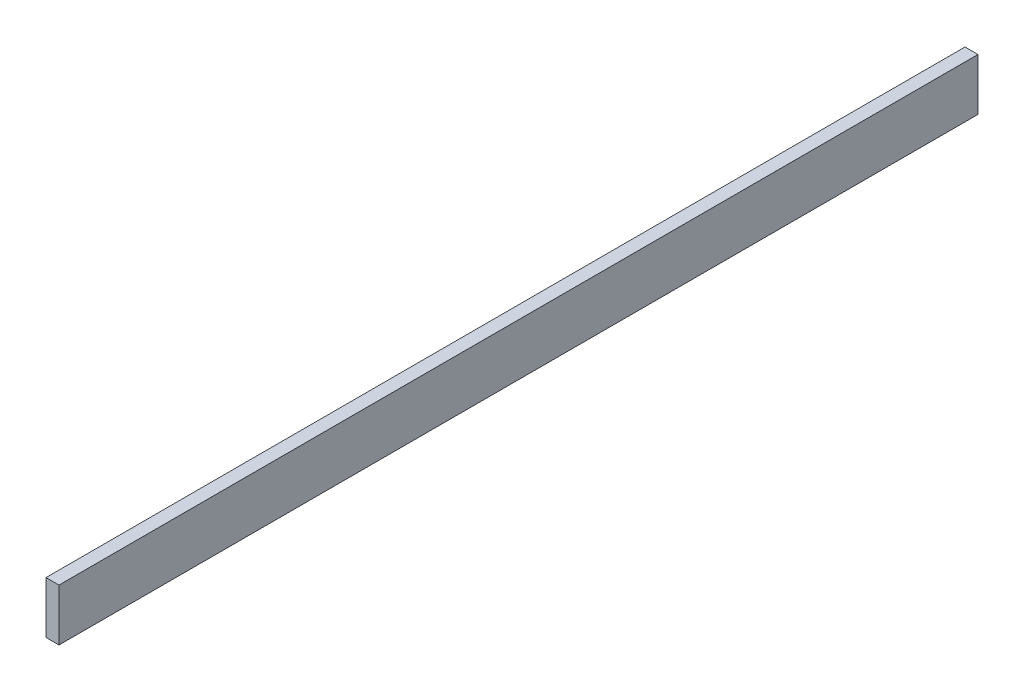
ISO-10303-21;
HEADER;
FILE_DESCRIPTION(('STEP AP214'),'2;1');
FILE_NAME('part.step','',(''),(''),'','','');
FILE_SCHEMA(('AUTOMOTIVE_DESIGN { 1 0 10303 214 1 1 1 1 }'));
ENDSEC;
DATA;
#1=APPLICATION_CONTEXT('core data for automotive mechanical design processes');
#2=APPLICATION_PROTOCOL_DEFINITION('international standard','automotive_design',2000,#1);
#3=PRODUCT_CONTEXT('',#1,'mechanical');
#4=PRODUCT('Part','Part','',(#3));
#5=PRODUCT_RELATED_PRODUCT_CATEGORY('part','',(#4));
#6=PRODUCT_DEFINITION_FORMATION('','',#4);
#7=PRODUCT_DEFINITION_CONTEXT('part definition',#1,'design');
#8=PRODUCT_DEFINITION('design','',#6,#7);
#9=PRODUCT_DEFINITION_SHAPE('','',#8);
#10=(LENGTH_UNIT() NAMED_UNIT(*) SI_UNIT(.MILLI.,.METRE.));
#11=(NAMED_UNIT(*) PLANE_ANGLE_UNIT() SI_UNIT($,.RADIAN.));
#12=(NAMED_UNIT(*) SI_UNIT($,.STERADIAN.) SOLID_ANGLE_UNIT());
#13=UNCERTAINTY_MEASURE_WITH_UNIT(LENGTH_MEASURE(1.E-05),#10,'distance_accuracy_value','');
#14=(GEOMETRIC_REPRESENTATION_CONTEXT(3) GLOBAL_UNCERTAINTY_ASSIGNED_CONTEXT((#13)) GLOBAL_UNIT_ASSIGNED_CONTEXT((#10,
#11,#12)) REPRESENTATION_CONTEXT('',''));
#15=CARTESIAN_POINT('',(0.,0.,0.));
#16=DIRECTION('',(0.,0.,1.));
#17=DIRECTION('',(1.,0.,0.));
#18=AXIS2_PLACEMENT_3D('',#15,#16,#17);
#19=CARTESIAN_POINT('',(0.,0.,224.79));
#20=DIRECTION('',(1.,0.,0.));
#21=DIRECTION('',(0.,0.,-1.));
#22=AXIS2_PLACEMENT_3D('',#19,#20,#21);
#23=PLANE('',#22);
#24=DIRECTION('',(0.,-1.,0.));
#25=VECTOR('',#24,1.);
#26=CARTESIAN_POINT('',(0.,0.,0.));
#27=LINE('',#26,#25);
#28=CARTESIAN_POINT('',(0.,12.7,0.));
#29=VERTEX_POINT('',#28);
#30=CARTESIAN_POINT('',(0.,0.,0.));
#31=VERTEX_POINT('',#30);
#32=EDGE_CURVE('E107',#29,#31,#27,.T.);
#33=ORIENTED_EDGE('',*,*,#32,.T.);
#34=DIRECTION('',(0.,0.,-1.));
#35=VECTOR('',#34,1.);
#36=CARTESIAN_POINT('',(0.,0.,224.79));
#37=LINE('',#36,#35);
#38=CARTESIAN_POINT('',(0.,0.,224.79));
#39=VERTEX_POINT('',#38);
#40=EDGE_CURVE('E11',#39,#31,#37,.T.);
#41=ORIENTED_EDGE('',*,*,#40,.F.);
#42=DIRECTION('',(0.,-1.,0.));
#43=VECTOR('',#42,1.);
#44=CARTESIAN_POINT('',(0.,0.,224.79));
#45=LINE('',#44,#43);
#46=CARTESIAN_POINT('',(0.,12.7,224.79));
#47=VERTEX_POINT('',#46);
#48=EDGE_CURVE('E91',#47,#39,#45,.T.);
#49=ORIENTED_EDGE('',*,*,#48,.F.);
#50=DIRECTION('',(0.,0.,-1.));
#51=VECTOR('',#50,1.);
#52=CARTESIAN_POINT('',(0.,12.7,224.79));
#53=LINE('',#52,#51);
#54=EDGE_CURVE('E103',#47,#29,#53,.T.);
#55=ORIENTED_EDGE('',*,*,#54,.T.);
#56=EDGE_LOOP('',(#33,#41,#49,#55));
#57=FACE_BOUND('',#56,.T.);
#58=ADVANCED_FACE('F39',(#57),#23,.F.);
#59=CARTESIAN_POINT('',(0.,0.,224.79));
#60=DIRECTION('',(0.,1.,0.));
#61=DIRECTION('',(0.,0.,1.));
#62=AXIS2_PLACEMENT_3D('',#59,#60,#61);
#63=PLANE('',#62);
#64=DIRECTION('',(1.,0.,0.));
#65=VECTOR('',#64,1.);
#66=CARTESIAN_POINT('',(0.,0.,0.));
#67=LINE('',#66,#65);
#68=CARTESIAN_POINT('',(3.175,0.,0.));
#69=VERTEX_POINT('',#68);
#70=EDGE_CURVE('E96',#31,#69,#67,.T.);
#71=ORIENTED_EDGE('',*,*,#70,.T.);
#72=DIRECTION('',(0.,0.,-1.));
#73=VECTOR('',#72,1.);
#74=CARTESIAN_POINT('',(3.175,0.,224.79));
#75=LINE('',#74,#73);
#76=CARTESIAN_POINT('',(3.175,0.,224.79));
#77=VERTEX_POINT('',#76);
#78=EDGE_CURVE('E48',#77,#69,#75,.T.);
#79=ORIENTED_EDGE('',*,*,#78,.F.);
#80=DIRECTION('',(1.,0.,0.));
#81=VECTOR('',#80,1.);
#82=CARTESIAN_POINT('',(0.,0.,224.79));
#83=LINE('',#82,#81);
#84=EDGE_CURVE('E86',#39,#77,#83,.T.);
#85=ORIENTED_EDGE('',*,*,#84,.F.);
#86=ORIENTED_EDGE('',*,*,#40,.T.);
#87=EDGE_LOOP('',(#71,#79,#85,#86));
#88=FACE_BOUND('',#87,.T.);
#89=ADVANCED_FACE('F95',(#88),#63,.F.);
#90=CARTESIAN_POINT('',(3.175,0.,224.79));
#91=DIRECTION('',(-1.,0.,0.));
#92=DIRECTION('',(0.,0.,1.));
#93=AXIS2_PLACEMENT_3D('',#90,#91,#92);
#94=PLANE('',#93);
#95=DIRECTION('',(0.,1.,0.));
#96=VECTOR('',#95,1.);
#97=CARTESIAN_POINT('',(3.175,0.,0.));
#98=LINE('',#97,#96);
#99=CARTESIAN_POINT('',(3.175,12.7,0.));
#100=VERTEX_POINT('',#99);
#101=EDGE_CURVE('E73',#69,#100,#98,.T.);
#102=ORIENTED_EDGE('',*,*,#101,.T.);
#103=DIRECTION('',(0.,0.,-1.));
#104=VECTOR('',#103,1.);
#105=CARTESIAN_POINT('',(3.175,12.7,224.79));
#106=LINE('',#105,#104);
#107=CARTESIAN_POINT('',(3.175,12.7,224.79));
#108=VERTEX_POINT('',#107);
#109=EDGE_CURVE('E98',#108,#100,#106,.T.);
#110=ORIENTED_EDGE('',*,*,#109,.F.);
#111=DIRECTION('',(0.,1.,0.));
#112=VECTOR('',#111,1.);
#113=CARTESIAN_POINT('',(3.175,0.,224.79));
#114=LINE('',#113,#112);
#115=EDGE_CURVE('E89',#77,#108,#114,.T.);
#116=ORIENTED_EDGE('',*,*,#115,.F.);
#117=ORIENTED_EDGE('',*,*,#78,.T.);
#118=EDGE_LOOP('',(#102,#110,#116,#117));
#119=FACE_BOUND('',#118,.T.);
#120=ADVANCED_FACE('F99',(#119),#94,.F.);
#121=CARTESIAN_POINT('',(0.,12.7,224.79));
#122=DIRECTION('',(0.,-1.,0.));
#123=DIRECTION('',(0.,0.,-1.));
#124=AXIS2_PLACEMENT_3D('',#121,#122,#123);
#125=PLANE('',#124);
#126=DIRECTION('',(-1.,0.,0.));
#127=VECTOR('',#126,1.);
#128=CARTESIAN_POINT('',(0.,12.7,0.));
#129=LINE('',#128,#127);
#130=EDGE_CURVE('E79',#100,#29,#129,.T.);
#131=ORIENTED_EDGE('',*,*,#130,.T.);
#132=ORIENTED_EDGE('',*,*,#54,.F.);
#133=DIRECTION('',(-1.,0.,0.));
#134=VECTOR('',#133,1.);
#135=CARTESIAN_POINT('',(0.,12.7,224.79));
#136=LINE('',#135,#134);
#137=EDGE_CURVE('E56',#108,#47,#136,.T.);
#138=ORIENTED_EDGE('',*,*,#137,.F.);
#139=ORIENTED_EDGE('',*,*,#109,.T.);
#140=EDGE_LOOP('',(#131,#132,#138,#139));
#141=FACE_BOUND('',#140,.T.);
#142=ADVANCED_FACE('F120',(#141),#125,.F.);
#143=CARTESIAN_POINT('',(0.,0.,224.79));
#144=DIRECTION('',(0.,0.,-1.));
#145=DIRECTION('',(-1.,0.,0.));
#146=AXIS2_PLACEMENT_3D('',#143,#144,#145);
#147=PLANE('',#146);
#148=ORIENTED_EDGE('',*,*,#48,.T.);
#149=ORIENTED_EDGE('',*,*,#84,.T.);
#150=ORIENTED_EDGE('',*,*,#115,.T.);
#151=ORIENTED_EDGE('',*,*,#137,.T.);
#152=EDGE_LOOP('',(#148,#149,#150,#151));
#153=FACE_BOUND('',#152,.T.);
#154=ADVANCED_FACE('F87',(#153),#147,.F.);
#155=CARTESIAN_POINT('',(0.,0.,0.));
#156=DIRECTION('',(0.,0.,-1.));
#157=DIRECTION('',(-1.,0.,0.));
#158=AXIS2_PLACEMENT_3D('',#155,#156,#157);
#159=PLANE('',#158);
#160=ORIENTED_EDGE('',*,*,#32,.F.);
#161=ORIENTED_EDGE('',*,*,#130,.F.);
#162=ORIENTED_EDGE('',*,*,#101,.F.);
#163=ORIENTED_EDGE('',*,*,#70,.F.);
#164=EDGE_LOOP('',(#160,#161,#162,#163));
#165=FACE_BOUND('',#164,.T.);
#166=ADVANCED_FACE('F123',(#165),#159,.T.);
#167=CLOSED_SHELL('',(#58,#89,#120,#142,#154,#166));
#168=MANIFOLD_SOLID_BREP('B2',#167);
#169=ADVANCED_BREP_SHAPE_REPRESENTATION('',(#18,#168),#14);
#170=SHAPE_DEFINITION_REPRESENTATION(#9,#169);
ENDSEC;
END-ISO-10303-21;
